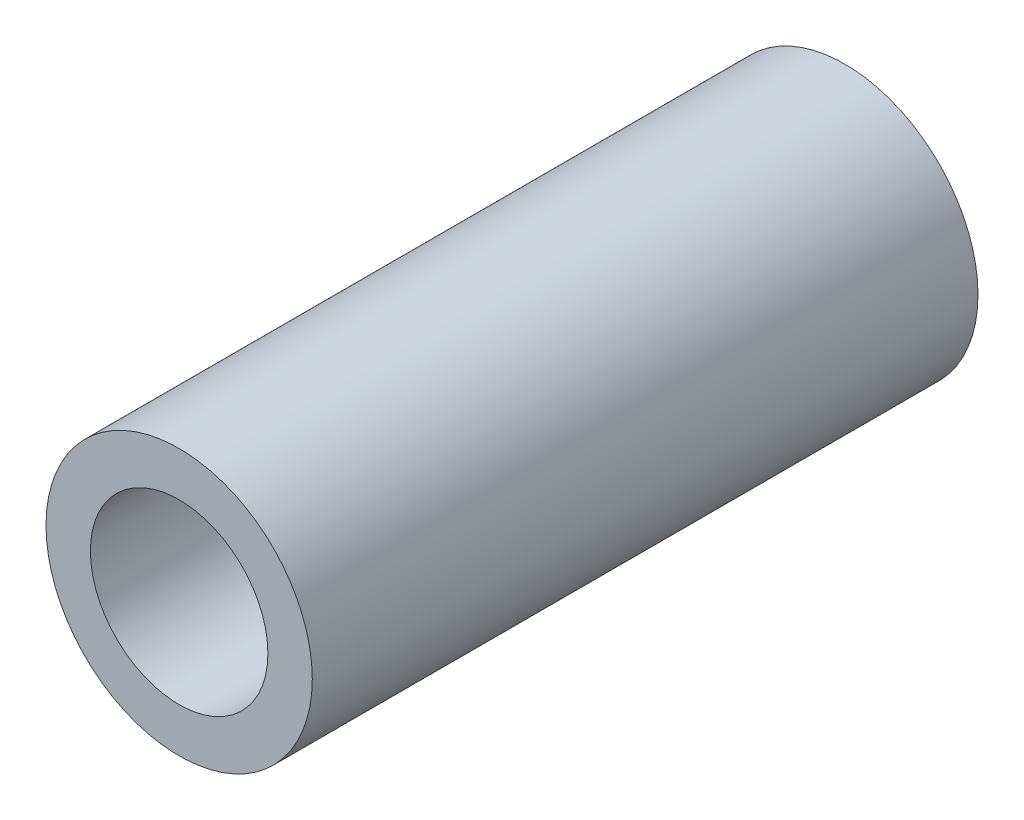
ISO-10303-21;
HEADER;
FILE_DESCRIPTION(('STEP AP214'),'2;1');
FILE_NAME('part.step','',(''),(''),'','','');
FILE_SCHEMA(('AUTOMOTIVE_DESIGN { 1 0 10303 214 1 1 1 1 }'));
ENDSEC;
DATA;
#1=APPLICATION_CONTEXT('core data for automotive mechanical design processes');
#2=APPLICATION_PROTOCOL_DEFINITION('international standard','automotive_design',2000,#1);
#3=PRODUCT_CONTEXT('',#1,'mechanical');
#4=PRODUCT('Part','Part','',(#3));
#5=PRODUCT_RELATED_PRODUCT_CATEGORY('part','',(#4));
#6=PRODUCT_DEFINITION_FORMATION('','',#4);
#7=PRODUCT_DEFINITION_CONTEXT('part definition',#1,'design');
#8=PRODUCT_DEFINITION('design','',#6,#7);
#9=PRODUCT_DEFINITION_SHAPE('','',#8);
#10=(LENGTH_UNIT() NAMED_UNIT(*) SI_UNIT(.MILLI.,.METRE.));
#11=(NAMED_UNIT(*) PLANE_ANGLE_UNIT() SI_UNIT($,.RADIAN.));
#12=(NAMED_UNIT(*) SI_UNIT($,.STERADIAN.) SOLID_ANGLE_UNIT());
#13=UNCERTAINTY_MEASURE_WITH_UNIT(LENGTH_MEASURE(1.E-05),#10,'distance_accuracy_value','');
#14=(GEOMETRIC_REPRESENTATION_CONTEXT(3) GLOBAL_UNCERTAINTY_ASSIGNED_CONTEXT((#13)) GLOBAL_UNIT_ASSIGNED_CONTEXT((#10,
#11,#12)) REPRESENTATION_CONTEXT('',''));
#15=CARTESIAN_POINT('',(0.,0.,0.));
#16=DIRECTION('',(0.,0.,1.));
#17=DIRECTION('',(1.,0.,0.));
#18=AXIS2_PLACEMENT_3D('',#15,#16,#17);
#19=CARTESIAN_POINT('',(0.,0.,15.));
#20=DIRECTION('',(0.,0.,1.));
#21=DIRECTION('',(1.,0.,0.));
#22=AXIS2_PLACEMENT_3D('',#19,#20,#21);
#23=PLANE('',#22);
#24=CARTESIAN_POINT('',(0.,0.,15.));
#25=DIRECTION('',(0.,0.,1.));
#26=DIRECTION('',(1.,0.,0.));
#27=AXIS2_PLACEMENT_3D('',#24,#25,#26);
#28=CIRCLE('',#27,3.);
#29=CARTESIAN_POINT('',(3.,0.,15.));
#30=VERTEX_POINT('',#29);
#31=EDGE_CURVE('E10',#30,#30,#28,.T.);
#32=ORIENTED_EDGE('',*,*,#31,.T.);
#33=EDGE_LOOP('',(#32));
#34=FACE_BOUND('',#33,.T.);
#35=CARTESIAN_POINT('',(0.,0.,15.));
#36=DIRECTION('',(0.,0.,1.));
#37=DIRECTION('',(1.,0.,0.));
#38=AXIS2_PLACEMENT_3D('',#35,#36,#37);
#39=CIRCLE('',#38,2.);
#40=CARTESIAN_POINT('',(2.,0.,15.));
#41=VERTEX_POINT('',#40);
#42=EDGE_CURVE('E50',#41,#41,#39,.T.);
#43=ORIENTED_EDGE('',*,*,#42,.F.);
#44=EDGE_LOOP('',(#43));
#45=FACE_BOUND('',#44,.T.);
#46=ADVANCED_FACE('F37',(#34,#45),#23,.T.);
#47=CARTESIAN_POINT('',(0.,0.,0.));
#48=DIRECTION('',(0.,0.,1.));
#49=DIRECTION('',(1.,0.,0.));
#50=AXIS2_PLACEMENT_3D('',#47,#48,#49);
#51=PLANE('',#50);
#52=CARTESIAN_POINT('',(0.,0.,0.));
#53=DIRECTION('',(0.,0.,1.));
#54=DIRECTION('',(1.,0.,0.));
#55=AXIS2_PLACEMENT_3D('',#52,#53,#54);
#56=CIRCLE('',#55,3.);
#57=CARTESIAN_POINT('',(3.,0.,0.));
#58=VERTEX_POINT('',#57);
#59=EDGE_CURVE('E41',#58,#58,#56,.T.);
#60=ORIENTED_EDGE('',*,*,#59,.F.);
#61=EDGE_LOOP('',(#60));
#62=FACE_BOUND('',#61,.T.);
#63=CARTESIAN_POINT('',(0.,0.,0.));
#64=DIRECTION('',(0.,0.,1.));
#65=DIRECTION('',(1.,0.,0.));
#66=AXIS2_PLACEMENT_3D('',#63,#64,#65);
#67=CIRCLE('',#66,2.);
#68=CARTESIAN_POINT('',(2.,0.,0.));
#69=VERTEX_POINT('',#68);
#70=EDGE_CURVE('E52',#69,#69,#67,.T.);
#71=ORIENTED_EDGE('',*,*,#70,.T.);
#72=EDGE_LOOP('',(#71));
#73=FACE_BOUND('',#72,.T.);
#74=ADVANCED_FACE('F64',(#62,#73),#51,.F.);
#75=CARTESIAN_POINT('',(0.,0.,15.));
#76=DIRECTION('',(0.,0.,-1.));
#77=DIRECTION('',(-1.,0.,0.));
#78=AXIS2_PLACEMENT_3D('',#75,#76,#77);
#79=CYLINDRICAL_SURFACE('',#78,3.);
#80=ORIENTED_EDGE('',*,*,#31,.F.);
#81=EDGE_LOOP('',(#80));
#82=FACE_BOUND('',#81,.T.);
#83=ORIENTED_EDGE('',*,*,#59,.T.);
#84=EDGE_LOOP('',(#83));
#85=FACE_BOUND('',#84,.T.);
#86=ADVANCED_FACE('F39',(#82,#85),#79,.T.);
#87=CARTESIAN_POINT('',(0.,0.,15.));
#88=DIRECTION('',(0.,0.,-1.));
#89=DIRECTION('',(-1.,0.,0.));
#90=AXIS2_PLACEMENT_3D('',#87,#88,#89);
#91=CYLINDRICAL_SURFACE('',#90,2.);
#92=ORIENTED_EDGE('',*,*,#42,.T.);
#93=EDGE_LOOP('',(#92));
#94=FACE_BOUND('',#93,.T.);
#95=ORIENTED_EDGE('',*,*,#70,.F.);
#96=EDGE_LOOP('',(#95));
#97=FACE_BOUND('',#96,.T.);
#98=ADVANCED_FACE('F60',(#94,#97),#91,.F.);
#99=CLOSED_SHELL('',(#46,#74,#86,#98));
#100=MANIFOLD_SOLID_BREP('B2',#99);
#101=ADVANCED_BREP_SHAPE_REPRESENTATION('',(#18,#100),#14);
#102=SHAPE_DEFINITION_REPRESENTATION(#9,#101);
ENDSEC;
END-ISO-10303-21;
